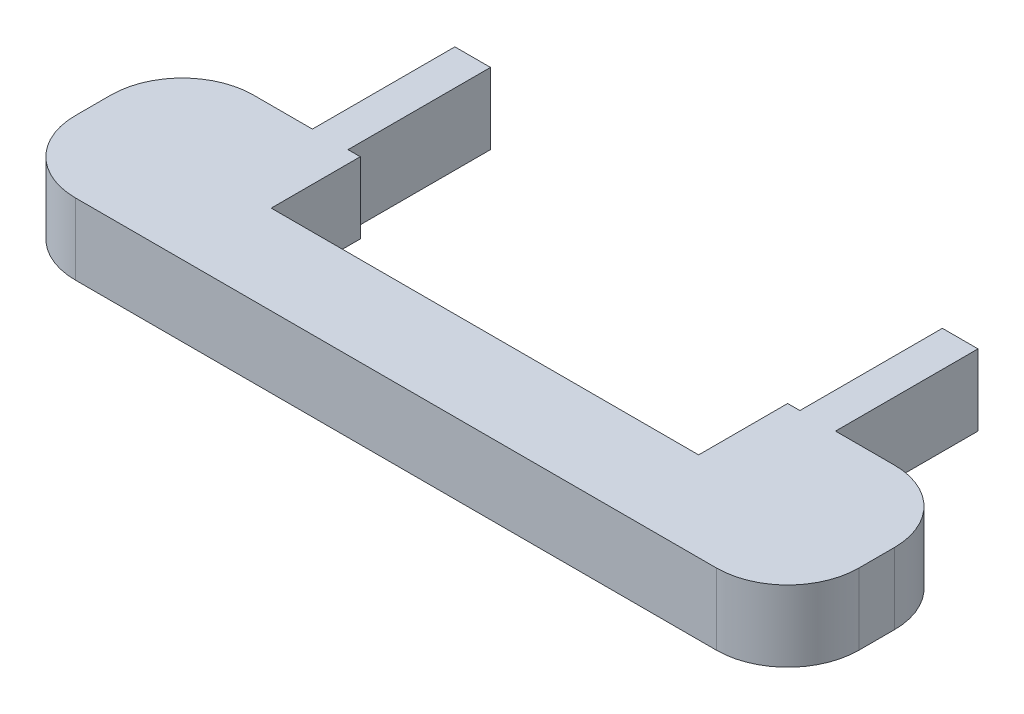
ISO-10303-21;
HEADER;
FILE_DESCRIPTION(('STEP AP214'),'2;1');
FILE_NAME('part.step','',(''),(''),'','','');
FILE_SCHEMA(('AUTOMOTIVE_DESIGN { 1 0 10303 214 1 1 1 1 }'));
ENDSEC;
DATA;
#1=APPLICATION_CONTEXT('core data for automotive mechanical design processes');
#2=APPLICATION_PROTOCOL_DEFINITION('international standard','automotive_design',2000,#1);
#3=PRODUCT_CONTEXT('',#1,'mechanical');
#4=PRODUCT('Part','Part','',(#3));
#5=PRODUCT_RELATED_PRODUCT_CATEGORY('part','',(#4));
#6=PRODUCT_DEFINITION_FORMATION('','',#4);
#7=PRODUCT_DEFINITION_CONTEXT('part definition',#1,'design');
#8=PRODUCT_DEFINITION('design','',#6,#7);
#9=PRODUCT_DEFINITION_SHAPE('','',#8);
#10=(LENGTH_UNIT() NAMED_UNIT(*) SI_UNIT(.MILLI.,.METRE.));
#11=(NAMED_UNIT(*) PLANE_ANGLE_UNIT() SI_UNIT($,.RADIAN.));
#12=(NAMED_UNIT(*) SI_UNIT($,.STERADIAN.) SOLID_ANGLE_UNIT());
#13=UNCERTAINTY_MEASURE_WITH_UNIT(LENGTH_MEASURE(1.E-05),#10,'distance_accuracy_value','');
#14=(GEOMETRIC_REPRESENTATION_CONTEXT(3) GLOBAL_UNCERTAINTY_ASSIGNED_CONTEXT((#13)) GLOBAL_UNIT_ASSIGNED_CONTEXT((#10,
#11,#12)) REPRESENTATION_CONTEXT('',''));
#15=CARTESIAN_POINT('',(0.,0.,0.));
#16=DIRECTION('',(0.,0.,1.));
#17=DIRECTION('',(1.,0.,0.));
#18=AXIS2_PLACEMENT_3D('',#15,#16,#17);
#19=CARTESIAN_POINT('',(-27.94,5.08,-6.35));
#20=DIRECTION('',(0.,0.,1.));
#21=DIRECTION('',(1.,0.,0.));
#22=AXIS2_PLACEMENT_3D('',#19,#20,#21);
#23=PLANE('',#22);
#24=DIRECTION('',(-1.,0.,0.));
#25=VECTOR('',#24,1.);
#26=CARTESIAN_POINT('',(-27.94,5.08,-6.35));
#27=LINE('',#26,#25);
#28=CARTESIAN_POINT('',(16.112512253315,5.08,-6.35));
#29=VERTEX_POINT('',#28);
#30=CARTESIAN_POINT('',(15.24,5.08,-6.35));
#31=VERTEX_POINT('',#30);
#32=EDGE_CURVE('E48',#29,#31,#27,.T.);
#33=ORIENTED_EDGE('',*,*,#32,.F.);
#34=DIRECTION('',(0.,-1.,0.));
#35=VECTOR('',#34,1.);
#36=CARTESIAN_POINT('',(16.112512253315,0.,-6.35));
#37=LINE('',#36,#35);
#38=CARTESIAN_POINT('',(16.112512253315,0.,-6.35));
#39=VERTEX_POINT('',#38);
#40=EDGE_CURVE('E177',#29,#39,#37,.T.);
#41=ORIENTED_EDGE('',*,*,#40,.T.);
#42=DIRECTION('',(-1.,0.,0.));
#43=VECTOR('',#42,1.);
#44=CARTESIAN_POINT('',(-27.94,0.,-6.35));
#45=LINE('',#44,#43);
#46=CARTESIAN_POINT('',(15.24,0.,-6.35));
#47=VERTEX_POINT('',#46);
#48=EDGE_CURVE('E281',#39,#47,#45,.T.);
#49=ORIENTED_EDGE('',*,*,#48,.T.);
#50=DIRECTION('',(0.,1.,0.));
#51=VECTOR('',#50,1.);
#52=CARTESIAN_POINT('',(15.24,0.,-6.35));
#53=LINE('',#52,#51);
#54=EDGE_CURVE('E245',#47,#31,#53,.T.);
#55=ORIENTED_EDGE('',*,*,#54,.T.);
#56=EDGE_LOOP('',(#33,#41,#49,#55));
#57=FACE_BOUND('',#56,.T.);
#58=ADVANCED_FACE('F33',(#57),#23,.F.);
#59=DIRECTION('',(0.,-1.,0.));
#60=VECTOR('',#59,1.);
#61=CARTESIAN_POINT('',(-16.112512253315,0.,-6.35));
#62=LINE('',#61,#60);
#63=CARTESIAN_POINT('',(-16.112512253315,5.08,-6.35));
#64=VERTEX_POINT('',#63);
#65=CARTESIAN_POINT('',(-16.112512253315,0.,-6.35));
#66=VERTEX_POINT('',#65);
#67=EDGE_CURVE('E180',#64,#66,#62,.T.);
#68=ORIENTED_EDGE('',*,*,#67,.F.);
#69=CARTESIAN_POINT('',(-15.24,5.08,-6.35));
#70=VERTEX_POINT('',#69);
#71=EDGE_CURVE('E269',#70,#64,#27,.T.);
#72=ORIENTED_EDGE('',*,*,#71,.F.);
#73=DIRECTION('',(0.,1.,0.));
#74=VECTOR('',#73,1.);
#75=CARTESIAN_POINT('',(-15.24,0.,-6.35));
#76=LINE('',#75,#74);
#77=CARTESIAN_POINT('',(-15.24,0.,-6.35));
#78=VERTEX_POINT('',#77);
#79=EDGE_CURVE('E258',#78,#70,#76,.T.);
#80=ORIENTED_EDGE('',*,*,#79,.F.);
#81=EDGE_CURVE('E282',#78,#66,#45,.T.);
#82=ORIENTED_EDGE('',*,*,#81,.T.);
#83=EDGE_LOOP('',(#68,#72,#80,#82));
#84=FACE_BOUND('',#83,.T.);
#85=ADVANCED_FACE('F341',(#84),#23,.F.);
#86=DIRECTION('',(0.,1.,0.));
#87=VECTOR('',#86,1.);
#88=CARTESIAN_POINT('',(-18.652512253315,0.,-6.35));
#89=LINE('',#88,#87);
#90=CARTESIAN_POINT('',(-18.652512253315,0.,-6.35));
#91=VERTEX_POINT('',#90);
#92=CARTESIAN_POINT('',(-18.652512253315,5.08,-6.35));
#93=VERTEX_POINT('',#92);
#94=EDGE_CURVE('E212',#91,#93,#89,.T.);
#95=ORIENTED_EDGE('',*,*,#94,.F.);
#96=CARTESIAN_POINT('',(-22.86,0.,-6.35));
#97=VERTEX_POINT('',#96);
#98=EDGE_CURVE('E277',#91,#97,#45,.T.);
#99=ORIENTED_EDGE('',*,*,#98,.T.);
#100=DIRECTION('',(0.,-1.,0.));
#101=VECTOR('',#100,1.);
#102=CARTESIAN_POINT('',(-22.86,5.08,-6.35));
#103=LINE('',#102,#101);
#104=CARTESIAN_POINT('',(-22.86,5.08,-6.35));
#105=VERTEX_POINT('',#104);
#106=EDGE_CURVE('E313',#97,#105,#103,.F.);
#107=ORIENTED_EDGE('',*,*,#106,.T.);
#108=EDGE_CURVE('E264',#93,#105,#27,.T.);
#109=ORIENTED_EDGE('',*,*,#108,.F.);
#110=EDGE_LOOP('',(#95,#99,#107,#109));
#111=FACE_BOUND('',#110,.T.);
#112=ADVANCED_FACE('F343',(#111),#23,.F.);
#113=CARTESIAN_POINT('',(22.86,0.,-6.35));
#114=VERTEX_POINT('',#113);
#115=CARTESIAN_POINT('',(18.652512253315,0.,-6.35));
#116=VERTEX_POINT('',#115);
#117=EDGE_CURVE('E278',#114,#116,#45,.T.);
#118=ORIENTED_EDGE('',*,*,#117,.T.);
#119=DIRECTION('',(0.,1.,0.));
#120=VECTOR('',#119,1.);
#121=CARTESIAN_POINT('',(18.652512253315,0.,-6.35));
#122=LINE('',#121,#120);
#123=CARTESIAN_POINT('',(18.652512253315,5.08,-6.35));
#124=VERTEX_POINT('',#123);
#125=EDGE_CURVE('E56',#116,#124,#122,.T.);
#126=ORIENTED_EDGE('',*,*,#125,.T.);
#127=CARTESIAN_POINT('',(22.86,5.08,-6.35));
#128=VERTEX_POINT('',#127);
#129=EDGE_CURVE('E266',#128,#124,#27,.T.);
#130=ORIENTED_EDGE('',*,*,#129,.F.);
#131=DIRECTION('',(0.,-1.,0.));
#132=VECTOR('',#131,1.);
#133=CARTESIAN_POINT('',(22.86,5.08,-6.35));
#134=LINE('',#133,#132);
#135=EDGE_CURVE('E316',#128,#114,#134,.T.);
#136=ORIENTED_EDGE('',*,*,#135,.T.);
#137=EDGE_LOOP('',(#118,#126,#130,#136));
#138=FACE_BOUND('',#137,.T.);
#139=ADVANCED_FACE('F335',(#138),#23,.F.);
#140=CARTESIAN_POINT('',(27.94,5.08,6.35));
#141=DIRECTION('',(-1.,0.,0.));
#142=DIRECTION('',(0.,0.,1.));
#143=AXIS2_PLACEMENT_3D('',#140,#141,#142);
#144=PLANE('',#143);
#145=DIRECTION('',(0.,0.,-1.));
#146=VECTOR('',#145,1.);
#147=CARTESIAN_POINT('',(27.94,0.,6.35));
#148=LINE('',#147,#146);
#149=CARTESIAN_POINT('',(27.94,0.,1.27));
#150=VERTEX_POINT('',#149);
#151=CARTESIAN_POINT('',(27.94,0.,-1.27));
#152=VERTEX_POINT('',#151);
#153=EDGE_CURVE('E255',#150,#152,#148,.T.);
#154=ORIENTED_EDGE('',*,*,#153,.T.);
#155=DIRECTION('',(0.,-1.,0.));
#156=VECTOR('',#155,1.);
#157=CARTESIAN_POINT('',(27.94,5.08,-1.27));
#158=LINE('',#157,#156);
#159=CARTESIAN_POINT('',(27.94,5.08,-1.27));
#160=VERTEX_POINT('',#159);
#161=EDGE_CURVE('E11',#152,#160,#158,.F.);
#162=ORIENTED_EDGE('',*,*,#161,.T.);
#163=DIRECTION('',(0.,0.,-1.));
#164=VECTOR('',#163,1.);
#165=CARTESIAN_POINT('',(27.94,5.08,6.35));
#166=LINE('',#165,#164);
#167=CARTESIAN_POINT('',(27.94,5.08,1.27));
#168=VERTEX_POINT('',#167);
#169=EDGE_CURVE('E261',#168,#160,#166,.T.);
#170=ORIENTED_EDGE('',*,*,#169,.F.);
#171=DIRECTION('',(0.,-1.,0.));
#172=VECTOR('',#171,1.);
#173=CARTESIAN_POINT('',(27.94,5.08,1.27));
#174=LINE('',#173,#172);
#175=EDGE_CURVE('E41',#168,#150,#174,.T.);
#176=ORIENTED_EDGE('',*,*,#175,.T.);
#177=EDGE_LOOP('',(#154,#162,#170,#176));
#178=FACE_BOUND('',#177,.T.);
#179=ADVANCED_FACE('F323',(#178),#144,.F.);
#180=CARTESIAN_POINT('',(-27.94,5.08,6.35));
#181=DIRECTION('',(1.,0.,0.));
#182=DIRECTION('',(0.,0.,-1.));
#183=AXIS2_PLACEMENT_3D('',#180,#181,#182);
#184=PLANE('',#183);
#185=DIRECTION('',(0.,0.,1.));
#186=VECTOR('',#185,1.);
#187=CARTESIAN_POINT('',(-27.94,0.,6.35));
#188=LINE('',#187,#186);
#189=CARTESIAN_POINT('',(-27.94,0.,-1.27));
#190=VERTEX_POINT('',#189);
#191=CARTESIAN_POINT('',(-27.94,0.,1.27));
#192=VERTEX_POINT('',#191);
#193=EDGE_CURVE('E280',#190,#192,#188,.T.);
#194=ORIENTED_EDGE('',*,*,#193,.T.);
#195=DIRECTION('',(0.,-1.,0.));
#196=VECTOR('',#195,1.);
#197=CARTESIAN_POINT('',(-27.94,5.08,1.27));
#198=LINE('',#197,#196);
#199=CARTESIAN_POINT('',(-27.94,5.08,1.27));
#200=VERTEX_POINT('',#199);
#201=EDGE_CURVE('E303',#192,#200,#198,.F.);
#202=ORIENTED_EDGE('',*,*,#201,.T.);
#203=DIRECTION('',(0.,0.,1.));
#204=VECTOR('',#203,1.);
#205=CARTESIAN_POINT('',(-27.94,5.08,6.35));
#206=LINE('',#205,#204);
#207=CARTESIAN_POINT('',(-27.94,5.08,-1.27));
#208=VERTEX_POINT('',#207);
#209=EDGE_CURVE('E268',#208,#200,#206,.T.);
#210=ORIENTED_EDGE('',*,*,#209,.F.);
#211=DIRECTION('',(0.,-1.,0.));
#212=VECTOR('',#211,1.);
#213=CARTESIAN_POINT('',(-27.94,5.08,-1.27));
#214=LINE('',#213,#212);
#215=EDGE_CURVE('E300',#208,#190,#214,.T.);
#216=ORIENTED_EDGE('',*,*,#215,.T.);
#217=EDGE_LOOP('',(#194,#202,#210,#216));
#218=FACE_BOUND('',#217,.T.);
#219=ADVANCED_FACE('F383',(#218),#184,.F.);
#220=CARTESIAN_POINT('',(-27.94,5.08,6.35));
#221=DIRECTION('',(0.,0.,-1.));
#222=DIRECTION('',(-1.,0.,0.));
#223=AXIS2_PLACEMENT_3D('',#220,#221,#222);
#224=PLANE('',#223);
#225=DIRECTION('',(1.,0.,0.));
#226=VECTOR('',#225,1.);
#227=CARTESIAN_POINT('',(-27.94,5.08,6.35));
#228=LINE('',#227,#226);
#229=CARTESIAN_POINT('',(-22.86,5.08,6.35));
#230=VERTEX_POINT('',#229);
#231=CARTESIAN_POINT('',(22.86,5.08,6.35));
#232=VERTEX_POINT('',#231);
#233=EDGE_CURVE('E271',#230,#232,#228,.T.);
#234=ORIENTED_EDGE('',*,*,#233,.F.);
#235=DIRECTION('',(0.,-1.,0.));
#236=VECTOR('',#235,1.);
#237=CARTESIAN_POINT('',(-22.86,5.08,6.35));
#238=LINE('',#237,#236);
#239=CARTESIAN_POINT('',(-22.86,0.,6.35));
#240=VERTEX_POINT('',#239);
#241=EDGE_CURVE('E288',#230,#240,#238,.T.);
#242=ORIENTED_EDGE('',*,*,#241,.T.);
#243=DIRECTION('',(1.,0.,0.));
#244=VECTOR('',#243,1.);
#245=CARTESIAN_POINT('',(-27.94,0.,6.35));
#246=LINE('',#245,#244);
#247=CARTESIAN_POINT('',(22.86,0.,6.35));
#248=VERTEX_POINT('',#247);
#249=EDGE_CURVE('E265',#240,#248,#246,.T.);
#250=ORIENTED_EDGE('',*,*,#249,.T.);
#251=DIRECTION('',(0.,-1.,0.));
#252=VECTOR('',#251,1.);
#253=CARTESIAN_POINT('',(22.86,5.08,6.35));
#254=LINE('',#253,#252);
#255=EDGE_CURVE('E274',#248,#232,#254,.F.);
#256=ORIENTED_EDGE('',*,*,#255,.T.);
#257=EDGE_LOOP('',(#234,#242,#250,#256));
#258=FACE_BOUND('',#257,.T.);
#259=ADVANCED_FACE('F391',(#258),#224,.F.);
#260=CARTESIAN_POINT('',(0.,5.08,0.));
#261=DIRECTION('',(0.,-1.,0.));
#262=DIRECTION('',(0.,0.,-1.));
#263=AXIS2_PLACEMENT_3D('',#260,#261,#262);
#264=PLANE('',#263);
#265=ORIENTED_EDGE('',*,*,#209,.T.);
#266=CARTESIAN_POINT('',(-22.86,5.08,1.27));
#267=DIRECTION('',(0.,-1.,0.));
#268=DIRECTION('',(0.,0.,-1.));
#269=AXIS2_PLACEMENT_3D('',#266,#267,#268);
#270=CIRCLE('',#269,5.08);
#271=EDGE_CURVE('E311',#200,#230,#270,.F.);
#272=ORIENTED_EDGE('',*,*,#271,.T.);
#273=ORIENTED_EDGE('',*,*,#233,.T.);
#274=CARTESIAN_POINT('',(22.86,5.08,1.27));
#275=DIRECTION('',(0.,-1.,0.));
#276=DIRECTION('',(0.,0.,-1.));
#277=AXIS2_PLACEMENT_3D('',#274,#275,#276);
#278=CIRCLE('',#277,5.08);
#279=EDGE_CURVE('E305',#232,#168,#278,.F.);
#280=ORIENTED_EDGE('',*,*,#279,.T.);
#281=ORIENTED_EDGE('',*,*,#169,.T.);
#282=CARTESIAN_POINT('',(22.86,5.08,-1.27));
#283=DIRECTION('',(0.,-1.,0.));
#284=DIRECTION('',(0.,0.,-1.));
#285=AXIS2_PLACEMENT_3D('',#282,#283,#284);
#286=CIRCLE('',#285,5.08);
#287=EDGE_CURVE('E307',#160,#128,#286,.F.);
#288=ORIENTED_EDGE('',*,*,#287,.T.);
#289=ORIENTED_EDGE('',*,*,#129,.T.);
#290=DIRECTION('',(0.,0.,1.));
#291=VECTOR('',#290,1.);
#292=CARTESIAN_POINT('',(18.652512253315,5.08,-16.51));
#293=LINE('',#292,#291);
#294=CARTESIAN_POINT('',(18.652512253315,5.08,-16.51));
#295=VERTEX_POINT('',#294);
#296=EDGE_CURVE('E181',#295,#124,#293,.T.);
#297=ORIENTED_EDGE('',*,*,#296,.F.);
#298=DIRECTION('',(-1.,0.,0.));
#299=VECTOR('',#298,1.);
#300=CARTESIAN_POINT('',(16.112512253315,5.08,-16.51));
#301=LINE('',#300,#299);
#302=CARTESIAN_POINT('',(16.112512253315,5.08,-16.51));
#303=VERTEX_POINT('',#302);
#304=EDGE_CURVE('E187',#295,#303,#301,.T.);
#305=ORIENTED_EDGE('',*,*,#304,.T.);
#306=DIRECTION('',(0.,0.,1.));
#307=VECTOR('',#306,1.);
#308=CARTESIAN_POINT('',(16.112512253315,5.08,-16.51));
#309=LINE('',#308,#307);
#310=EDGE_CURVE('E171',#303,#29,#309,.T.);
#311=ORIENTED_EDGE('',*,*,#310,.T.);
#312=ORIENTED_EDGE('',*,*,#32,.T.);
#313=DIRECTION('',(0.,0.,-1.));
#314=VECTOR('',#313,1.);
#315=CARTESIAN_POINT('',(15.24,5.08,0.));
#316=LINE('',#315,#314);
#317=CARTESIAN_POINT('',(15.24,5.08,0.));
#318=VERTEX_POINT('',#317);
#319=EDGE_CURVE('E234',#318,#31,#316,.T.);
#320=ORIENTED_EDGE('',*,*,#319,.F.);
#321=DIRECTION('',(1.,0.,0.));
#322=VECTOR('',#321,1.);
#323=CARTESIAN_POINT('',(-15.24,5.08,0.));
#324=LINE('',#323,#322);
#325=CARTESIAN_POINT('',(-15.24,5.08,0.));
#326=VERTEX_POINT('',#325);
#327=EDGE_CURVE('E239',#326,#318,#324,.T.);
#328=ORIENTED_EDGE('',*,*,#327,.F.);
#329=DIRECTION('',(0.,0.,1.));
#330=VECTOR('',#329,1.);
#331=CARTESIAN_POINT('',(-15.24,5.08,0.));
#332=LINE('',#331,#330);
#333=EDGE_CURVE('E248',#70,#326,#332,.T.);
#334=ORIENTED_EDGE('',*,*,#333,.F.);
#335=ORIENTED_EDGE('',*,*,#71,.T.);
#336=DIRECTION('',(0.,0.,1.));
#337=VECTOR('',#336,1.);
#338=CARTESIAN_POINT('',(-16.112512253315,5.08,-16.51));
#339=LINE('',#338,#337);
#340=CARTESIAN_POINT('',(-16.112512253315,5.08,-16.51));
#341=VERTEX_POINT('',#340);
#342=EDGE_CURVE('E218',#341,#64,#339,.T.);
#343=ORIENTED_EDGE('',*,*,#342,.F.);
#344=DIRECTION('',(1.,0.,0.));
#345=VECTOR('',#344,1.);
#346=CARTESIAN_POINT('',(-16.112512253315,5.08,-16.51));
#347=LINE('',#346,#345);
#348=CARTESIAN_POINT('',(-18.652512253315,5.08,-16.51));
#349=VERTEX_POINT('',#348);
#350=EDGE_CURVE('E216',#349,#341,#347,.T.);
#351=ORIENTED_EDGE('',*,*,#350,.F.);
#352=DIRECTION('',(0.,0.,1.));
#353=VECTOR('',#352,1.);
#354=CARTESIAN_POINT('',(-18.652512253315,5.08,-16.51));
#355=LINE('',#354,#353);
#356=EDGE_CURVE('E225',#349,#93,#355,.T.);
#357=ORIENTED_EDGE('',*,*,#356,.T.);
#358=ORIENTED_EDGE('',*,*,#108,.T.);
#359=CARTESIAN_POINT('',(-22.86,5.08,-1.27));
#360=DIRECTION('',(0.,-1.,0.));
#361=DIRECTION('',(0.,0.,-1.));
#362=AXIS2_PLACEMENT_3D('',#359,#360,#361);
#363=CIRCLE('',#362,5.08);
#364=EDGE_CURVE('E309',#105,#208,#363,.F.);
#365=ORIENTED_EDGE('',*,*,#364,.T.);
#366=EDGE_LOOP('',(#265,#272,#273,#280,#281,#288,#289,#297,#305,#311,#312,#320,#328,#334,#335,
#343,#351,#357,#358,#365));
#367=FACE_BOUND('',#366,.T.);
#368=ADVANCED_FACE('F193',(#367),#264,.F.);
#369=CARTESIAN_POINT('',(0.,0.,0.));
#370=DIRECTION('',(0.,-1.,0.));
#371=DIRECTION('',(0.,0.,-1.));
#372=AXIS2_PLACEMENT_3D('',#369,#370,#371);
#373=PLANE('',#372);
#374=ORIENTED_EDGE('',*,*,#249,.F.);
#375=CARTESIAN_POINT('',(-22.86,0.,1.27));
#376=DIRECTION('',(0.,-1.,0.));
#377=DIRECTION('',(0.,0.,-1.));
#378=AXIS2_PLACEMENT_3D('',#375,#376,#377);
#379=CIRCLE('',#378,5.08);
#380=EDGE_CURVE('E298',#240,#192,#379,.T.);
#381=ORIENTED_EDGE('',*,*,#380,.T.);
#382=ORIENTED_EDGE('',*,*,#193,.F.);
#383=CARTESIAN_POINT('',(-22.86,0.,-1.27));
#384=DIRECTION('',(0.,-1.,0.));
#385=DIRECTION('',(0.,0.,-1.));
#386=AXIS2_PLACEMENT_3D('',#383,#384,#385);
#387=CIRCLE('',#386,5.08);
#388=EDGE_CURVE('E295',#190,#97,#387,.T.);
#389=ORIENTED_EDGE('',*,*,#388,.T.);
#390=ORIENTED_EDGE('',*,*,#98,.F.);
#391=DIRECTION('',(0.,0.,1.));
#392=VECTOR('',#391,1.);
#393=CARTESIAN_POINT('',(-18.652512253315,0.,-16.51));
#394=LINE('',#393,#392);
#395=CARTESIAN_POINT('',(-18.652512253315,0.,-16.51));
#396=VERTEX_POINT('',#395);
#397=EDGE_CURVE('E228',#396,#91,#394,.T.);
#398=ORIENTED_EDGE('',*,*,#397,.F.);
#399=DIRECTION('',(-1.,0.,0.));
#400=VECTOR('',#399,1.);
#401=CARTESIAN_POINT('',(-16.112512253315,0.,-16.51));
#402=LINE('',#401,#400);
#403=CARTESIAN_POINT('',(-16.112512253315,0.,-16.51));
#404=VERTEX_POINT('',#403);
#405=EDGE_CURVE('E211',#404,#396,#402,.T.);
#406=ORIENTED_EDGE('',*,*,#405,.F.);
#407=DIRECTION('',(0.,0.,1.));
#408=VECTOR('',#407,1.);
#409=CARTESIAN_POINT('',(-16.112512253315,0.,-16.51));
#410=LINE('',#409,#408);
#411=EDGE_CURVE('E231',#404,#66,#410,.T.);
#412=ORIENTED_EDGE('',*,*,#411,.T.);
#413=ORIENTED_EDGE('',*,*,#81,.F.);
#414=DIRECTION('',(0.,0.,1.));
#415=VECTOR('',#414,1.);
#416=CARTESIAN_POINT('',(-15.24,0.,0.));
#417=LINE('',#416,#415);
#418=CARTESIAN_POINT('',(-15.24,0.,0.));
#419=VERTEX_POINT('',#418);
#420=EDGE_CURVE('E238',#78,#419,#417,.T.);
#421=ORIENTED_EDGE('',*,*,#420,.T.);
#422=DIRECTION('',(1.,0.,0.));
#423=VECTOR('',#422,1.);
#424=CARTESIAN_POINT('',(-15.24,0.,0.));
#425=LINE('',#424,#423);
#426=CARTESIAN_POINT('',(15.24,0.,0.));
#427=VERTEX_POINT('',#426);
#428=EDGE_CURVE('E242',#419,#427,#425,.T.);
#429=ORIENTED_EDGE('',*,*,#428,.T.);
#430=DIRECTION('',(0.,0.,-1.));
#431=VECTOR('',#430,1.);
#432=CARTESIAN_POINT('',(15.24,0.,0.));
#433=LINE('',#432,#431);
#434=EDGE_CURVE('E235',#427,#47,#433,.T.);
#435=ORIENTED_EDGE('',*,*,#434,.T.);
#436=ORIENTED_EDGE('',*,*,#48,.F.);
#437=DIRECTION('',(0.,0.,1.));
#438=VECTOR('',#437,1.);
#439=CARTESIAN_POINT('',(16.112512253315,0.,-16.51));
#440=LINE('',#439,#438);
#441=CARTESIAN_POINT('',(16.112512253315,0.,-16.51));
#442=VERTEX_POINT('',#441);
#443=EDGE_CURVE('E200',#442,#39,#440,.T.);
#444=ORIENTED_EDGE('',*,*,#443,.F.);
#445=DIRECTION('',(1.,0.,0.));
#446=VECTOR('',#445,1.);
#447=CARTESIAN_POINT('',(16.112512253315,0.,-16.51));
#448=LINE('',#447,#446);
#449=CARTESIAN_POINT('',(18.652512253315,0.,-16.51));
#450=VERTEX_POINT('',#449);
#451=EDGE_CURVE('E190',#442,#450,#448,.T.);
#452=ORIENTED_EDGE('',*,*,#451,.T.);
#453=DIRECTION('',(0.,0.,1.));
#454=VECTOR('',#453,1.);
#455=CARTESIAN_POINT('',(18.652512253315,0.,-16.51));
#456=LINE('',#455,#454);
#457=EDGE_CURVE('E204',#450,#116,#456,.T.);
#458=ORIENTED_EDGE('',*,*,#457,.T.);
#459=ORIENTED_EDGE('',*,*,#117,.F.);
#460=CARTESIAN_POINT('',(22.86,0.,-1.27));
#461=DIRECTION('',(0.,-1.,0.));
#462=DIRECTION('',(0.,0.,-1.));
#463=AXIS2_PLACEMENT_3D('',#460,#461,#462);
#464=CIRCLE('',#463,5.08);
#465=EDGE_CURVE('E293',#114,#152,#464,.T.);
#466=ORIENTED_EDGE('',*,*,#465,.T.);
#467=ORIENTED_EDGE('',*,*,#153,.F.);
#468=CARTESIAN_POINT('',(22.86,0.,1.27));
#469=DIRECTION('',(0.,-1.,0.));
#470=DIRECTION('',(0.,0.,-1.));
#471=AXIS2_PLACEMENT_3D('',#468,#469,#470);
#472=CIRCLE('',#471,5.08);
#473=EDGE_CURVE('E291',#150,#248,#472,.T.);
#474=ORIENTED_EDGE('',*,*,#473,.T.);
#475=EDGE_LOOP('',(#374,#381,#382,#389,#390,#398,#406,#412,#413,#421,#429,#435,#436,#444,#452,
#458,#459,#466,#467,#474));
#476=FACE_BOUND('',#475,.T.);
#477=ADVANCED_FACE('F329',(#476),#373,.T.);
#478=CARTESIAN_POINT('',(15.24,0.,0.));
#479=DIRECTION('',(1.,0.,0.));
#480=DIRECTION('',(0.,0.,-1.));
#481=AXIS2_PLACEMENT_3D('',#478,#479,#480);
#482=PLANE('',#481);
#483=ORIENTED_EDGE('',*,*,#319,.T.);
#484=ORIENTED_EDGE('',*,*,#54,.F.);
#485=ORIENTED_EDGE('',*,*,#434,.F.);
#486=DIRECTION('',(0.,1.,0.));
#487=VECTOR('',#486,1.);
#488=CARTESIAN_POINT('',(15.24,0.,0.));
#489=LINE('',#488,#487);
#490=EDGE_CURVE('E253',#427,#318,#489,.T.);
#491=ORIENTED_EDGE('',*,*,#490,.T.);
#492=EDGE_LOOP('',(#483,#484,#485,#491));
#493=FACE_BOUND('',#492,.T.);
#494=ADVANCED_FACE('F419',(#493),#482,.F.);
#495=CARTESIAN_POINT('',(-15.24,0.,0.));
#496=DIRECTION('',(0.,0.,1.));
#497=DIRECTION('',(1.,0.,0.));
#498=AXIS2_PLACEMENT_3D('',#495,#496,#497);
#499=PLANE('',#498);
#500=ORIENTED_EDGE('',*,*,#327,.T.);
#501=ORIENTED_EDGE('',*,*,#490,.F.);
#502=ORIENTED_EDGE('',*,*,#428,.F.);
#503=DIRECTION('',(0.,1.,0.));
#504=VECTOR('',#503,1.);
#505=CARTESIAN_POINT('',(-15.24,0.,0.));
#506=LINE('',#505,#504);
#507=EDGE_CURVE('E256',#419,#326,#506,.T.);
#508=ORIENTED_EDGE('',*,*,#507,.T.);
#509=EDGE_LOOP('',(#500,#501,#502,#508));
#510=FACE_BOUND('',#509,.T.);
#511=ADVANCED_FACE('F424',(#510),#499,.F.);
#512=CARTESIAN_POINT('',(-15.24,0.,0.));
#513=DIRECTION('',(-1.,0.,0.));
#514=DIRECTION('',(0.,0.,1.));
#515=AXIS2_PLACEMENT_3D('',#512,#513,#514);
#516=PLANE('',#515);
#517=ORIENTED_EDGE('',*,*,#333,.T.);
#518=ORIENTED_EDGE('',*,*,#507,.F.);
#519=ORIENTED_EDGE('',*,*,#420,.F.);
#520=ORIENTED_EDGE('',*,*,#79,.T.);
#521=EDGE_LOOP('',(#517,#518,#519,#520));
#522=FACE_BOUND('',#521,.T.);
#523=ADVANCED_FACE('F406',(#522),#516,.F.);
#524=CARTESIAN_POINT('',(-22.86,5.08,1.27));
#525=DIRECTION('',(0.,-1.,0.));
#526=DIRECTION('',(0.,0.,-1.));
#527=AXIS2_PLACEMENT_3D('',#524,#525,#526);
#528=CYLINDRICAL_SURFACE('',#527,5.08);
#529=ORIENTED_EDGE('',*,*,#271,.F.);
#530=ORIENTED_EDGE('',*,*,#201,.F.);
#531=ORIENTED_EDGE('',*,*,#380,.F.);
#532=ORIENTED_EDGE('',*,*,#241,.F.);
#533=EDGE_LOOP('',(#529,#530,#531,#532));
#534=FACE_BOUND('',#533,.T.);
#535=ADVANCED_FACE('F388',(#534),#528,.T.);
#536=CARTESIAN_POINT('',(-22.86,5.08,-1.27));
#537=DIRECTION('',(0.,-1.,0.));
#538=DIRECTION('',(0.,0.,-1.));
#539=AXIS2_PLACEMENT_3D('',#536,#537,#538);
#540=CYLINDRICAL_SURFACE('',#539,5.08);
#541=ORIENTED_EDGE('',*,*,#364,.F.);
#542=ORIENTED_EDGE('',*,*,#106,.F.);
#543=ORIENTED_EDGE('',*,*,#388,.F.);
#544=ORIENTED_EDGE('',*,*,#215,.F.);
#545=EDGE_LOOP('',(#541,#542,#543,#544));
#546=FACE_BOUND('',#545,.T.);
#547=ADVANCED_FACE('F381',(#546),#540,.T.);
#548=CARTESIAN_POINT('',(22.86,5.08,-1.27));
#549=DIRECTION('',(0.,-1.,0.));
#550=DIRECTION('',(0.,0.,-1.));
#551=AXIS2_PLACEMENT_3D('',#548,#549,#550);
#552=CYLINDRICAL_SURFACE('',#551,5.08);
#553=ORIENTED_EDGE('',*,*,#287,.F.);
#554=ORIENTED_EDGE('',*,*,#161,.F.);
#555=ORIENTED_EDGE('',*,*,#465,.F.);
#556=ORIENTED_EDGE('',*,*,#135,.F.);
#557=EDGE_LOOP('',(#553,#554,#555,#556));
#558=FACE_BOUND('',#557,.T.);
#559=ADVANCED_FACE('F334',(#558),#552,.T.);
#560=CARTESIAN_POINT('',(22.86,5.08,1.27));
#561=DIRECTION('',(0.,-1.,0.));
#562=DIRECTION('',(0.,0.,-1.));
#563=AXIS2_PLACEMENT_3D('',#560,#561,#562);
#564=CYLINDRICAL_SURFACE('',#563,5.08);
#565=ORIENTED_EDGE('',*,*,#279,.F.);
#566=ORIENTED_EDGE('',*,*,#255,.F.);
#567=ORIENTED_EDGE('',*,*,#473,.F.);
#568=ORIENTED_EDGE('',*,*,#175,.F.);
#569=EDGE_LOOP('',(#565,#566,#567,#568));
#570=FACE_BOUND('',#569,.T.);
#571=ADVANCED_FACE('F35',(#570),#564,.T.);
#572=CARTESIAN_POINT('',(-16.112512253315,0.,-16.51));
#573=DIRECTION('',(-1.,0.,0.));
#574=DIRECTION('',(0.,0.,1.));
#575=AXIS2_PLACEMENT_3D('',#572,#573,#574);
#576=PLANE('',#575);
#577=ORIENTED_EDGE('',*,*,#67,.T.);
#578=ORIENTED_EDGE('',*,*,#411,.F.);
#579=DIRECTION('',(0.,-1.,0.));
#580=VECTOR('',#579,1.);
#581=CARTESIAN_POINT('',(-16.112512253315,0.,-16.51));
#582=LINE('',#581,#580);
#583=EDGE_CURVE('E208',#341,#404,#582,.T.);
#584=ORIENTED_EDGE('',*,*,#583,.F.);
#585=ORIENTED_EDGE('',*,*,#342,.T.);
#586=EDGE_LOOP('',(#577,#578,#584,#585));
#587=FACE_BOUND('',#586,.T.);
#588=ADVANCED_FACE('F372',(#587),#576,.F.);
#589=CARTESIAN_POINT('',(-18.652512253315,0.,-16.51));
#590=DIRECTION('',(1.,0.,0.));
#591=DIRECTION('',(0.,0.,-1.));
#592=AXIS2_PLACEMENT_3D('',#589,#590,#591);
#593=PLANE('',#592);
#594=ORIENTED_EDGE('',*,*,#94,.T.);
#595=ORIENTED_EDGE('',*,*,#356,.F.);
#596=DIRECTION('',(0.,1.,0.));
#597=VECTOR('',#596,1.);
#598=CARTESIAN_POINT('',(-18.652512253315,0.,-16.51));
#599=LINE('',#598,#597);
#600=EDGE_CURVE('E214',#396,#349,#599,.T.);
#601=ORIENTED_EDGE('',*,*,#600,.F.);
#602=ORIENTED_EDGE('',*,*,#397,.T.);
#603=EDGE_LOOP('',(#594,#595,#601,#602));
#604=FACE_BOUND('',#603,.T.);
#605=ADVANCED_FACE('F362',(#604),#593,.F.);
#606=CARTESIAN_POINT('',(0.,0.,-16.51));
#607=DIRECTION('',(0.,0.,1.));
#608=DIRECTION('',(1.,0.,0.));
#609=AXIS2_PLACEMENT_3D('',#606,#607,#608);
#610=PLANE('',#609);
#611=ORIENTED_EDGE('',*,*,#583,.T.);
#612=ORIENTED_EDGE('',*,*,#405,.T.);
#613=ORIENTED_EDGE('',*,*,#600,.T.);
#614=ORIENTED_EDGE('',*,*,#350,.T.);
#615=EDGE_LOOP('',(#611,#612,#613,#614));
#616=FACE_BOUND('',#615,.T.);
#617=ADVANCED_FACE('F434',(#616),#610,.F.);
#618=CARTESIAN_POINT('',(16.112512253315,0.,-16.51));
#619=DIRECTION('',(-1.,0.,0.));
#620=DIRECTION('',(0.,0.,1.));
#621=AXIS2_PLACEMENT_3D('',#618,#619,#620);
#622=PLANE('',#621);
#623=ORIENTED_EDGE('',*,*,#40,.F.);
#624=ORIENTED_EDGE('',*,*,#310,.F.);
#625=DIRECTION('',(0.,-1.,0.));
#626=VECTOR('',#625,1.);
#627=CARTESIAN_POINT('',(16.112512253315,0.,-16.51));
#628=LINE('',#627,#626);
#629=EDGE_CURVE('E175',#303,#442,#628,.T.);
#630=ORIENTED_EDGE('',*,*,#629,.T.);
#631=ORIENTED_EDGE('',*,*,#443,.T.);
#632=EDGE_LOOP('',(#623,#624,#630,#631));
#633=FACE_BOUND('',#632,.T.);
#634=ADVANCED_FACE('F173',(#633),#622,.T.);
#635=CARTESIAN_POINT('',(18.652512253315,0.,-16.51));
#636=DIRECTION('',(1.,0.,0.));
#637=DIRECTION('',(0.,0.,-1.));
#638=AXIS2_PLACEMENT_3D('',#635,#636,#637);
#639=PLANE('',#638);
#640=ORIENTED_EDGE('',*,*,#125,.F.);
#641=ORIENTED_EDGE('',*,*,#457,.F.);
#642=DIRECTION('',(0.,1.,0.));
#643=VECTOR('',#642,1.);
#644=CARTESIAN_POINT('',(18.652512253315,0.,-16.51));
#645=LINE('',#644,#643);
#646=EDGE_CURVE('E195',#450,#295,#645,.T.);
#647=ORIENTED_EDGE('',*,*,#646,.T.);
#648=ORIENTED_EDGE('',*,*,#296,.T.);
#649=EDGE_LOOP('',(#640,#641,#647,#648));
#650=FACE_BOUND('',#649,.T.);
#651=ADVANCED_FACE('F337',(#650),#639,.T.);
#652=CARTESIAN_POINT('',(0.,0.,-16.51));
#653=DIRECTION('',(0.,0.,1.));
#654=DIRECTION('',(-1.,0.,0.));
#655=AXIS2_PLACEMENT_3D('',#652,#653,#654);
#656=PLANE('',#655);
#657=ORIENTED_EDGE('',*,*,#629,.F.);
#658=ORIENTED_EDGE('',*,*,#304,.F.);
#659=ORIENTED_EDGE('',*,*,#646,.F.);
#660=ORIENTED_EDGE('',*,*,#451,.F.);
#661=EDGE_LOOP('',(#657,#658,#659,#660));
#662=FACE_BOUND('',#661,.T.);
#663=ADVANCED_FACE('F185',(#662),#656,.F.);
#664=CLOSED_SHELL('',(#58,#85,#112,#139,#179,#219,#259,#368,#477,#494,#511,#523,#535,#547,#559,
#571,#588,#605,#617,#634,#651,#663));
#665=MANIFOLD_SOLID_BREP('B2',#664);
#666=ADVANCED_BREP_SHAPE_REPRESENTATION('',(#18,#665),#14);
#667=SHAPE_DEFINITION_REPRESENTATION(#9,#666);
ENDSEC;
END-ISO-10303-21;
